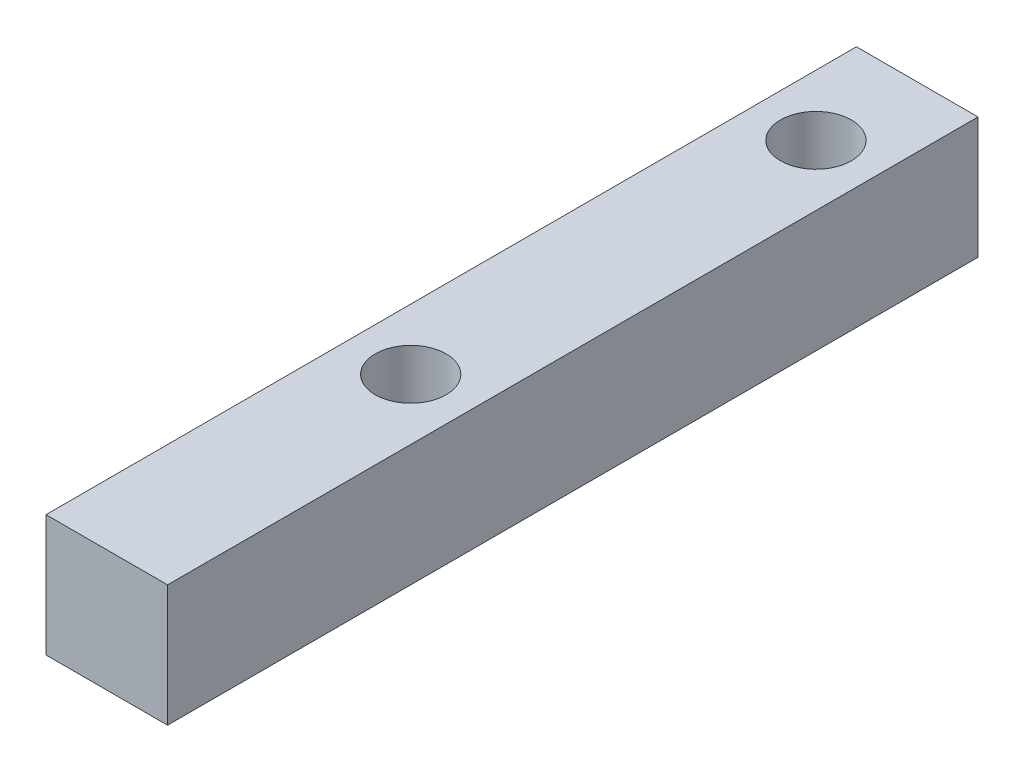
ISO-10303-21;
HEADER;
FILE_DESCRIPTION(('STEP AP214'),'2;1');
FILE_NAME('part.step','',(''),(''),'','','');
FILE_SCHEMA(('AUTOMOTIVE_DESIGN { 1 0 10303 214 1 1 1 1 }'));
ENDSEC;
DATA;
#1=APPLICATION_CONTEXT('core data for automotive mechanical design processes');
#2=APPLICATION_PROTOCOL_DEFINITION('international standard','automotive_design',2000,#1);
#3=PRODUCT_CONTEXT('',#1,'mechanical');
#4=PRODUCT('Part','Part','',(#3));
#5=PRODUCT_RELATED_PRODUCT_CATEGORY('part','',(#4));
#6=PRODUCT_DEFINITION_FORMATION('','',#4);
#7=PRODUCT_DEFINITION_CONTEXT('part definition',#1,'design');
#8=PRODUCT_DEFINITION('design','',#6,#7);
#9=PRODUCT_DEFINITION_SHAPE('','',#8);
#10=(LENGTH_UNIT() NAMED_UNIT(*) SI_UNIT(.MILLI.,.METRE.));
#11=(NAMED_UNIT(*) PLANE_ANGLE_UNIT() SI_UNIT($,.RADIAN.));
#12=(NAMED_UNIT(*) SI_UNIT($,.STERADIAN.) SOLID_ANGLE_UNIT());
#13=UNCERTAINTY_MEASURE_WITH_UNIT(LENGTH_MEASURE(1.E-05),#10,'distance_accuracy_value','');
#14=(GEOMETRIC_REPRESENTATION_CONTEXT(3) GLOBAL_UNCERTAINTY_ASSIGNED_CONTEXT((#13)) GLOBAL_UNIT_ASSIGNED_CONTEXT((#10,
#11,#12)) REPRESENTATION_CONTEXT('',''));
#15=CARTESIAN_POINT('',(0.,0.,0.));
#16=DIRECTION('',(0.,0.,1.));
#17=DIRECTION('',(1.,0.,0.));
#18=AXIS2_PLACEMENT_3D('',#15,#16,#17);
#19=CARTESIAN_POINT('',(0.,6.,0.));
#20=DIRECTION('',(0.,1.,0.));
#21=DIRECTION('',(0.,0.,1.));
#22=AXIS2_PLACEMENT_3D('',#19,#20,#21);
#23=PLANE('',#22);
#24=CARTESIAN_POINT('',(0.,6.,-15.));
#25=DIRECTION('',(0.,1.,0.));
#26=DIRECTION('',(0.,0.,1.));
#27=AXIS2_PLACEMENT_3D('',#24,#25,#26);
#28=CIRCLE('',#27,1.75);
#29=CARTESIAN_POINT('',(0.,6.,-13.25));
#30=VERTEX_POINT('',#29);
#31=EDGE_CURVE('E103',#30,#30,#28,.T.);
#32=ORIENTED_EDGE('',*,*,#31,.F.);
#33=EDGE_LOOP('',(#32));
#34=FACE_BOUND('',#33,.T.);
#35=DIRECTION('',(0.,0.,-1.));
#36=VECTOR('',#35,1.);
#37=CARTESIAN_POINT('',(3.,6.,-20.));
#38=LINE('',#37,#36);
#39=CARTESIAN_POINT('',(3.,6.,20.));
#40=VERTEX_POINT('',#39);
#41=CARTESIAN_POINT('',(3.,6.,-20.));
#42=VERTEX_POINT('',#41);
#43=EDGE_CURVE('E88',#40,#42,#38,.T.);
#44=ORIENTED_EDGE('',*,*,#43,.T.);
#45=DIRECTION('',(-1.,0.,0.));
#46=VECTOR('',#45,1.);
#47=CARTESIAN_POINT('',(-3.,6.,-20.));
#48=LINE('',#47,#46);
#49=CARTESIAN_POINT('',(-3.,6.,-20.));
#50=VERTEX_POINT('',#49);
#51=EDGE_CURVE('E83',#42,#50,#48,.T.);
#52=ORIENTED_EDGE('',*,*,#51,.T.);
#53=DIRECTION('',(0.,0.,1.));
#54=VECTOR('',#53,1.);
#55=CARTESIAN_POINT('',(-3.,6.,-20.));
#56=LINE('',#55,#54);
#57=CARTESIAN_POINT('',(-3.,6.,20.));
#58=VERTEX_POINT('',#57);
#59=EDGE_CURVE('E86',#50,#58,#56,.T.);
#60=ORIENTED_EDGE('',*,*,#59,.T.);
#61=DIRECTION('',(1.,0.,0.));
#62=VECTOR('',#61,1.);
#63=CARTESIAN_POINT('',(-3.,6.,20.));
#64=LINE('',#63,#62);
#65=EDGE_CURVE('E53',#58,#40,#64,.T.);
#66=ORIENTED_EDGE('',*,*,#65,.T.);
#67=EDGE_LOOP('',(#44,#52,#60,#66));
#68=FACE_BOUND('',#67,.T.);
#69=CARTESIAN_POINT('',(0.,6.,5.));
#70=DIRECTION('',(0.,1.,0.));
#71=DIRECTION('',(0.,0.,1.));
#72=AXIS2_PLACEMENT_3D('',#69,#70,#71);
#73=CIRCLE('',#72,1.75);
#74=CARTESIAN_POINT('',(0.,6.,6.75));
#75=VERTEX_POINT('',#74);
#76=EDGE_CURVE('E118',#75,#75,#73,.T.);
#77=ORIENTED_EDGE('',*,*,#76,.F.);
#78=EDGE_LOOP('',(#77));
#79=FACE_BOUND('',#78,.T.);
#80=ADVANCED_FACE('F36',(#34,#68,#79),#23,.T.);
#81=CARTESIAN_POINT('',(0.,0.,0.));
#82=DIRECTION('',(0.,1.,0.));
#83=DIRECTION('',(0.,0.,1.));
#84=AXIS2_PLACEMENT_3D('',#81,#82,#83);
#85=PLANE('',#84);
#86=DIRECTION('',(0.,0.,-1.));
#87=VECTOR('',#86,1.);
#88=CARTESIAN_POINT('',(3.,0.,-20.));
#89=LINE('',#88,#87);
#90=CARTESIAN_POINT('',(3.,0.,20.));
#91=VERTEX_POINT('',#90);
#92=CARTESIAN_POINT('',(3.,0.,-20.));
#93=VERTEX_POINT('',#92);
#94=EDGE_CURVE('E100',#91,#93,#89,.T.);
#95=ORIENTED_EDGE('',*,*,#94,.F.);
#96=DIRECTION('',(1.,0.,0.));
#97=VECTOR('',#96,1.);
#98=CARTESIAN_POINT('',(-3.,0.,20.));
#99=LINE('',#98,#97);
#100=CARTESIAN_POINT('',(-3.,0.,20.));
#101=VERTEX_POINT('',#100);
#102=EDGE_CURVE('E76',#101,#91,#99,.T.);
#103=ORIENTED_EDGE('',*,*,#102,.F.);
#104=DIRECTION('',(0.,0.,1.));
#105=VECTOR('',#104,1.);
#106=CARTESIAN_POINT('',(-3.,0.,-20.));
#107=LINE('',#106,#105);
#108=CARTESIAN_POINT('',(-3.,0.,-20.));
#109=VERTEX_POINT('',#108);
#110=EDGE_CURVE('E70',#109,#101,#107,.T.);
#111=ORIENTED_EDGE('',*,*,#110,.F.);
#112=DIRECTION('',(-1.,0.,0.));
#113=VECTOR('',#112,1.);
#114=CARTESIAN_POINT('',(-3.,0.,-20.));
#115=LINE('',#114,#113);
#116=EDGE_CURVE('E92',#93,#109,#115,.T.);
#117=ORIENTED_EDGE('',*,*,#116,.F.);
#118=EDGE_LOOP('',(#95,#103,#111,#117));
#119=FACE_BOUND('',#118,.T.);
#120=CARTESIAN_POINT('',(0.,0.,-15.));
#121=DIRECTION('',(0.,1.,0.));
#122=DIRECTION('',(0.,0.,1.));
#123=AXIS2_PLACEMENT_3D('',#120,#121,#122);
#124=CIRCLE('',#123,1.75);
#125=CARTESIAN_POINT('',(0.,0.,-13.25));
#126=VERTEX_POINT('',#125);
#127=EDGE_CURVE('E115',#126,#126,#124,.T.);
#128=ORIENTED_EDGE('',*,*,#127,.T.);
#129=EDGE_LOOP('',(#128));
#130=FACE_BOUND('',#129,.T.);
#131=CARTESIAN_POINT('',(0.,0.,5.));
#132=DIRECTION('',(0.,1.,0.));
#133=DIRECTION('',(0.,0.,1.));
#134=AXIS2_PLACEMENT_3D('',#131,#132,#133);
#135=CIRCLE('',#134,1.75);
#136=CARTESIAN_POINT('',(0.,0.,6.75));
#137=VERTEX_POINT('',#136);
#138=EDGE_CURVE('E121',#137,#137,#135,.T.);
#139=ORIENTED_EDGE('',*,*,#138,.T.);
#140=EDGE_LOOP('',(#139));
#141=FACE_BOUND('',#140,.T.);
#142=ADVANCED_FACE('F111',(#119,#130,#141),#85,.F.);
#143=CARTESIAN_POINT('',(3.,6.,-20.));
#144=DIRECTION('',(-1.,0.,0.));
#145=DIRECTION('',(0.,0.,1.));
#146=AXIS2_PLACEMENT_3D('',#143,#144,#145);
#147=PLANE('',#146);
#148=ORIENTED_EDGE('',*,*,#94,.T.);
#149=DIRECTION('',(0.,-1.,0.));
#150=VECTOR('',#149,1.);
#151=CARTESIAN_POINT('',(3.,6.,-20.));
#152=LINE('',#151,#150);
#153=EDGE_CURVE('E11',#42,#93,#152,.T.);
#154=ORIENTED_EDGE('',*,*,#153,.F.);
#155=ORIENTED_EDGE('',*,*,#43,.F.);
#156=DIRECTION('',(0.,-1.,0.));
#157=VECTOR('',#156,1.);
#158=CARTESIAN_POINT('',(3.,6.,20.));
#159=LINE('',#158,#157);
#160=EDGE_CURVE('E96',#40,#91,#159,.T.);
#161=ORIENTED_EDGE('',*,*,#160,.T.);
#162=EDGE_LOOP('',(#148,#154,#155,#161));
#163=FACE_BOUND('',#162,.T.);
#164=ADVANCED_FACE('F38',(#163),#147,.F.);
#165=CARTESIAN_POINT('',(-3.,6.,-20.));
#166=DIRECTION('',(0.,0.,1.));
#167=DIRECTION('',(1.,0.,0.));
#168=AXIS2_PLACEMENT_3D('',#165,#166,#167);
#169=PLANE('',#168);
#170=ORIENTED_EDGE('',*,*,#116,.T.);
#171=DIRECTION('',(0.,-1.,0.));
#172=VECTOR('',#171,1.);
#173=CARTESIAN_POINT('',(-3.,6.,-20.));
#174=LINE('',#173,#172);
#175=EDGE_CURVE('E45',#50,#109,#174,.T.);
#176=ORIENTED_EDGE('',*,*,#175,.F.);
#177=ORIENTED_EDGE('',*,*,#51,.F.);
#178=ORIENTED_EDGE('',*,*,#153,.T.);
#179=EDGE_LOOP('',(#170,#176,#177,#178));
#180=FACE_BOUND('',#179,.T.);
#181=ADVANCED_FACE('F91',(#180),#169,.F.);
#182=CARTESIAN_POINT('',(-3.,6.,-20.));
#183=DIRECTION('',(1.,0.,0.));
#184=DIRECTION('',(0.,0.,-1.));
#185=AXIS2_PLACEMENT_3D('',#182,#183,#184);
#186=PLANE('',#185);
#187=ORIENTED_EDGE('',*,*,#110,.T.);
#188=DIRECTION('',(0.,-1.,0.));
#189=VECTOR('',#188,1.);
#190=CARTESIAN_POINT('',(-3.,6.,20.));
#191=LINE('',#190,#189);
#192=EDGE_CURVE('E93',#58,#101,#191,.T.);
#193=ORIENTED_EDGE('',*,*,#192,.F.);
#194=ORIENTED_EDGE('',*,*,#59,.F.);
#195=ORIENTED_EDGE('',*,*,#175,.T.);
#196=EDGE_LOOP('',(#187,#193,#194,#195));
#197=FACE_BOUND('',#196,.T.);
#198=ADVANCED_FACE('F94',(#197),#186,.F.);
#199=CARTESIAN_POINT('',(-3.,6.,20.));
#200=DIRECTION('',(0.,0.,-1.));
#201=DIRECTION('',(-1.,0.,0.));
#202=AXIS2_PLACEMENT_3D('',#199,#200,#201);
#203=PLANE('',#202);
#204=ORIENTED_EDGE('',*,*,#102,.T.);
#205=ORIENTED_EDGE('',*,*,#160,.F.);
#206=ORIENTED_EDGE('',*,*,#65,.F.);
#207=ORIENTED_EDGE('',*,*,#192,.T.);
#208=EDGE_LOOP('',(#204,#205,#206,#207));
#209=FACE_BOUND('',#208,.T.);
#210=ADVANCED_FACE('F108',(#209),#203,.F.);
#211=CARTESIAN_POINT('',(0.,6.,-15.));
#212=DIRECTION('',(0.,-1.,0.));
#213=DIRECTION('',(0.,0.,-1.));
#214=AXIS2_PLACEMENT_3D('',#211,#212,#213);
#215=CYLINDRICAL_SURFACE('',#214,1.75);
#216=ORIENTED_EDGE('',*,*,#31,.T.);
#217=EDGE_LOOP('',(#216));
#218=FACE_BOUND('',#217,.T.);
#219=ORIENTED_EDGE('',*,*,#127,.F.);
#220=EDGE_LOOP('',(#219));
#221=FACE_BOUND('',#220,.T.);
#222=ADVANCED_FACE('F138',(#218,#221),#215,.F.);
#223=CARTESIAN_POINT('',(0.,6.,5.));
#224=DIRECTION('',(0.,-1.,0.));
#225=DIRECTION('',(0.,0.,-1.));
#226=AXIS2_PLACEMENT_3D('',#223,#224,#225);
#227=CYLINDRICAL_SURFACE('',#226,1.75);
#228=ORIENTED_EDGE('',*,*,#76,.T.);
#229=EDGE_LOOP('',(#228));
#230=FACE_BOUND('',#229,.T.);
#231=ORIENTED_EDGE('',*,*,#138,.F.);
#232=EDGE_LOOP('',(#231));
#233=FACE_BOUND('',#232,.T.);
#234=ADVANCED_FACE('F127',(#230,#233),#227,.F.);
#235=CLOSED_SHELL('',(#80,#142,#164,#181,#198,#210,#222,#234));
#236=MANIFOLD_SOLID_BREP('B2',#235);
#237=ADVANCED_BREP_SHAPE_REPRESENTATION('',(#18,#236),#14);
#238=SHAPE_DEFINITION_REPRESENTATION(#9,#237);
ENDSEC;
END-ISO-10303-21;
